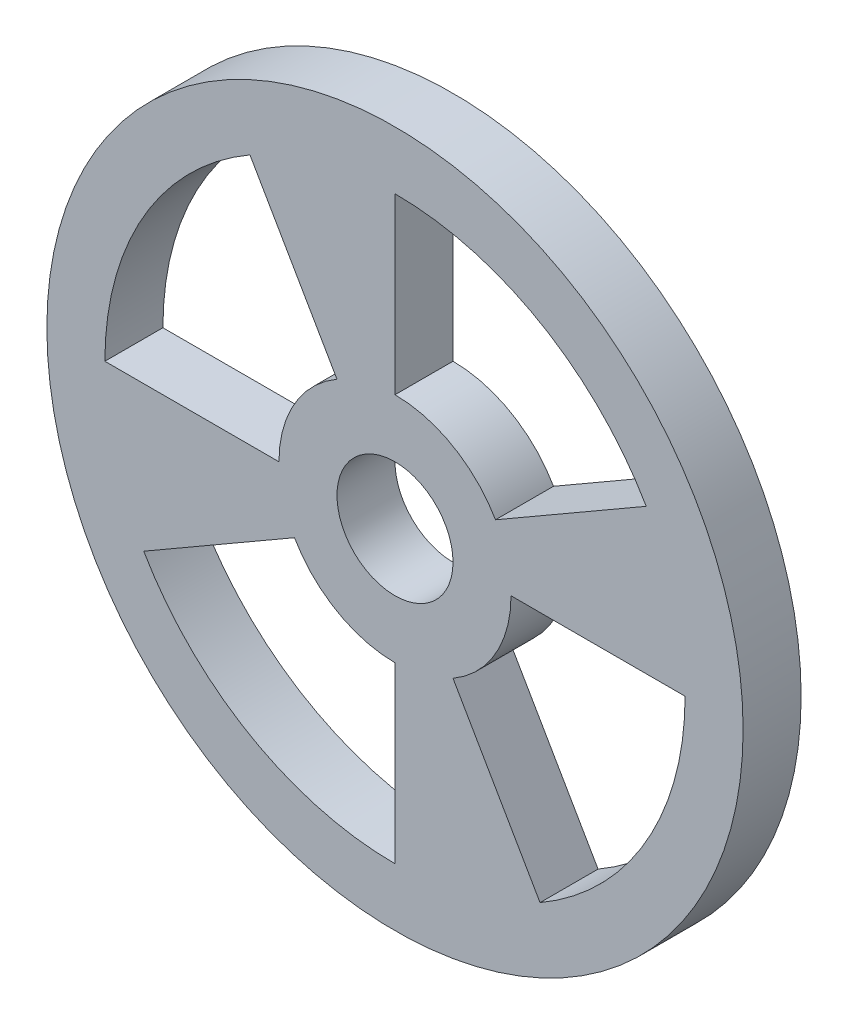
ISO-10303-21;
HEADER;
FILE_DESCRIPTION(('STEP AP214'),'2;1');
FILE_NAME('part.step','',(''),(''),'','','');
FILE_SCHEMA(('AUTOMOTIVE_DESIGN { 1 0 10303 214 1 1 1 1 }'));
ENDSEC;
DATA;
#1=APPLICATION_CONTEXT('core data for automotive mechanical design processes');
#2=APPLICATION_PROTOCOL_DEFINITION('international standard','automotive_design',2000,#1);
#3=PRODUCT_CONTEXT('',#1,'mechanical');
#4=PRODUCT('Part','Part','',(#3));
#5=PRODUCT_RELATED_PRODUCT_CATEGORY('part','',(#4));
#6=PRODUCT_DEFINITION_FORMATION('','',#4);
#7=PRODUCT_DEFINITION_CONTEXT('part definition',#1,'design');
#8=PRODUCT_DEFINITION('design','',#6,#7);
#9=PRODUCT_DEFINITION_SHAPE('','',#8);
#10=(LENGTH_UNIT() NAMED_UNIT(*) SI_UNIT(.MILLI.,.METRE.));
#11=(NAMED_UNIT(*) PLANE_ANGLE_UNIT() SI_UNIT($,.RADIAN.));
#12=(NAMED_UNIT(*) SI_UNIT($,.STERADIAN.) SOLID_ANGLE_UNIT());
#13=UNCERTAINTY_MEASURE_WITH_UNIT(LENGTH_MEASURE(1.E-05),#10,'distance_accuracy_value','');
#14=(GEOMETRIC_REPRESENTATION_CONTEXT(3) GLOBAL_UNCERTAINTY_ASSIGNED_CONTEXT((#13)) GLOBAL_UNIT_ASSIGNED_CONTEXT((#10,
#11,#12)) REPRESENTATION_CONTEXT('',''));
#15=CARTESIAN_POINT('',(0.,0.,0.));
#16=DIRECTION('',(0.,0.,1.));
#17=DIRECTION('',(1.,0.,0.));
#18=AXIS2_PLACEMENT_3D('',#15,#16,#17);
#19=CARTESIAN_POINT('',(0.,0.,10.));
#20=DIRECTION('',(0.,0.,1.));
#21=DIRECTION('',(1.,0.,0.));
#22=AXIS2_PLACEMENT_3D('',#19,#20,#21);
#23=PLANE('',#22);
#24=CARTESIAN_POINT('',(0.,0.,10.));
#25=DIRECTION('',(0.,0.,1.));
#26=DIRECTION('',(1.,0.,0.));
#27=AXIS2_PLACEMENT_3D('',#24,#25,#26);
#28=CIRCLE('',#27,50.0000000000001);
#29=CARTESIAN_POINT('',(25.,-43.3012701892219,10.));
#30=VERTEX_POINT('',#29);
#31=CARTESIAN_POINT('',(50.,0.,10.));
#32=VERTEX_POINT('',#31);
#33=EDGE_CURVE('E309',#30,#32,#28,.T.);
#34=ORIENTED_EDGE('',*,*,#33,.F.);
#35=DIRECTION('',(0.5,-0.866025403784439,0.));
#36=VECTOR('',#35,1.);
#37=CARTESIAN_POINT('',(0.,0.,10.));
#38=LINE('',#37,#36);
#39=CARTESIAN_POINT('',(10.,-17.3205080756888,10.));
#40=VERTEX_POINT('',#39);
#41=EDGE_CURVE('E306',#40,#30,#38,.T.);
#42=ORIENTED_EDGE('',*,*,#41,.F.);
#43=CARTESIAN_POINT('',(0.,0.,10.));
#44=DIRECTION('',(0.,0.,1.));
#45=DIRECTION('',(1.,0.,0.));
#46=AXIS2_PLACEMENT_3D('',#43,#44,#45);
#47=CIRCLE('',#46,20.0000000000001);
#48=CARTESIAN_POINT('',(20.,0.,10.));
#49=VERTEX_POINT('',#48);
#50=EDGE_CURVE('E244',#49,#40,#47,.F.);
#51=ORIENTED_EDGE('',*,*,#50,.F.);
#52=DIRECTION('',(-1.,0.,0.));
#53=VECTOR('',#52,1.);
#54=CARTESIAN_POINT('',(0.,0.,10.));
#55=LINE('',#54,#53);
#56=EDGE_CURVE('E301',#32,#49,#55,.T.);
#57=ORIENTED_EDGE('',*,*,#56,.F.);
#58=EDGE_LOOP('',(#34,#42,#51,#57));
#59=FACE_BOUND('',#58,.T.);
#60=CARTESIAN_POINT('',(0.,0.,10.));
#61=DIRECTION('',(0.,0.,1.));
#62=DIRECTION('',(1.,0.,0.));
#63=AXIS2_PLACEMENT_3D('',#60,#61,#62);
#64=CIRCLE('',#63,50.0000000000001);
#65=CARTESIAN_POINT('',(-43.3012701892219,-25.,10.));
#66=VERTEX_POINT('',#65);
#67=CARTESIAN_POINT('',(0.,-50.,10.));
#68=VERTEX_POINT('',#67);
#69=EDGE_CURVE('E298',#66,#68,#64,.T.);
#70=ORIENTED_EDGE('',*,*,#69,.F.);
#71=DIRECTION('',(-0.866025403784439,-0.5,0.));
#72=VECTOR('',#71,1.);
#73=CARTESIAN_POINT('',(0.,0.,10.));
#74=LINE('',#73,#72);
#75=CARTESIAN_POINT('',(-17.3205080756888,-10.,10.));
#76=VERTEX_POINT('',#75);
#77=EDGE_CURVE('E295',#76,#66,#74,.T.);
#78=ORIENTED_EDGE('',*,*,#77,.F.);
#79=CARTESIAN_POINT('',(0.,0.,10.));
#80=DIRECTION('',(0.,0.,1.));
#81=DIRECTION('',(1.,0.,0.));
#82=AXIS2_PLACEMENT_3D('',#79,#80,#81);
#83=CIRCLE('',#82,20.0000000000001);
#84=CARTESIAN_POINT('',(0.,-20.,10.));
#85=VERTEX_POINT('',#84);
#86=EDGE_CURVE('E292',#85,#76,#83,.F.);
#87=ORIENTED_EDGE('',*,*,#86,.F.);
#88=DIRECTION('',(0.,1.,0.));
#89=VECTOR('',#88,1.);
#90=CARTESIAN_POINT('',(0.,0.,10.));
#91=LINE('',#90,#89);
#92=EDGE_CURVE('E289',#68,#85,#91,.T.);
#93=ORIENTED_EDGE('',*,*,#92,.F.);
#94=EDGE_LOOP('',(#70,#78,#87,#93));
#95=FACE_BOUND('',#94,.T.);
#96=CARTESIAN_POINT('',(0.,0.,10.));
#97=DIRECTION('',(0.,0.,1.));
#98=DIRECTION('',(1.,0.,0.));
#99=AXIS2_PLACEMENT_3D('',#96,#97,#98);
#100=CIRCLE('',#99,50.0000000000001);
#101=CARTESIAN_POINT('',(-25.,43.3012701892219,10.));
#102=VERTEX_POINT('',#101);
#103=CARTESIAN_POINT('',(-50.,0.,10.));
#104=VERTEX_POINT('',#103);
#105=EDGE_CURVE('E186',#102,#104,#100,.T.);
#106=ORIENTED_EDGE('',*,*,#105,.F.);
#107=DIRECTION('',(-0.5,0.866025403784439,0.));
#108=VECTOR('',#107,1.);
#109=CARTESIAN_POINT('',(0.,0.,10.));
#110=LINE('',#109,#108);
#111=CARTESIAN_POINT('',(-10.,17.3205080756888,10.));
#112=VERTEX_POINT('',#111);
#113=EDGE_CURVE('E285',#112,#102,#110,.T.);
#114=ORIENTED_EDGE('',*,*,#113,.F.);
#115=CARTESIAN_POINT('',(0.,0.,10.));
#116=DIRECTION('',(0.,0.,1.));
#117=DIRECTION('',(1.,0.,0.));
#118=AXIS2_PLACEMENT_3D('',#115,#116,#117);
#119=CIRCLE('',#118,20.0000000000001);
#120=CARTESIAN_POINT('',(-20.,0.,10.));
#121=VERTEX_POINT('',#120);
#122=EDGE_CURVE('E282',#121,#112,#119,.F.);
#123=ORIENTED_EDGE('',*,*,#122,.F.);
#124=DIRECTION('',(1.,0.,0.));
#125=VECTOR('',#124,1.);
#126=CARTESIAN_POINT('',(0.,0.,10.));
#127=LINE('',#126,#125);
#128=EDGE_CURVE('E251',#104,#121,#127,.T.);
#129=ORIENTED_EDGE('',*,*,#128,.F.);
#130=EDGE_LOOP('',(#106,#114,#123,#129));
#131=FACE_BOUND('',#130,.T.);
#132=CARTESIAN_POINT('',(0.,0.,10.));
#133=DIRECTION('',(0.,0.,1.));
#134=DIRECTION('',(1.,0.,0.));
#135=AXIS2_PLACEMENT_3D('',#132,#133,#134);
#136=CIRCLE('',#135,50.0000000000001);
#137=CARTESIAN_POINT('',(43.3012701892219,25.,10.));
#138=VERTEX_POINT('',#137);
#139=CARTESIAN_POINT('',(0.,50.,10.));
#140=VERTEX_POINT('',#139);
#141=EDGE_CURVE('E336',#138,#140,#136,.T.);
#142=ORIENTED_EDGE('',*,*,#141,.F.);
#143=DIRECTION('',(0.866025403784439,0.5,0.));
#144=VECTOR('',#143,1.);
#145=CARTESIAN_POINT('',(0.,0.,10.));
#146=LINE('',#145,#144);
#147=CARTESIAN_POINT('',(17.3205080756888,10.,10.));
#148=VERTEX_POINT('',#147);
#149=EDGE_CURVE('E333',#148,#138,#146,.T.);
#150=ORIENTED_EDGE('',*,*,#149,.F.);
#151=CARTESIAN_POINT('',(0.,0.,10.));
#152=DIRECTION('',(0.,0.,1.));
#153=DIRECTION('',(1.,0.,0.));
#154=AXIS2_PLACEMENT_3D('',#151,#152,#153);
#155=CIRCLE('',#154,20.0000000000001);
#156=CARTESIAN_POINT('',(0.,20.,10.));
#157=VERTEX_POINT('',#156);
#158=EDGE_CURVE('E330',#157,#148,#155,.F.);
#159=ORIENTED_EDGE('',*,*,#158,.F.);
#160=DIRECTION('',(0.,-1.,0.));
#161=VECTOR('',#160,1.);
#162=CARTESIAN_POINT('',(0.,0.,10.));
#163=LINE('',#162,#161);
#164=EDGE_CURVE('E317',#140,#157,#163,.T.);
#165=ORIENTED_EDGE('',*,*,#164,.F.);
#166=EDGE_LOOP('',(#142,#150,#159,#165));
#167=FACE_BOUND('',#166,.T.);
#168=CARTESIAN_POINT('',(0.,0.,10.));
#169=DIRECTION('',(0.,0.,1.));
#170=DIRECTION('',(1.,0.,0.));
#171=AXIS2_PLACEMENT_3D('',#168,#169,#170);
#172=CIRCLE('',#171,60.);
#173=CARTESIAN_POINT('',(60.,0.,10.));
#174=VERTEX_POINT('',#173);
#175=EDGE_CURVE('E348',#174,#174,#172,.T.);
#176=ORIENTED_EDGE('',*,*,#175,.T.);
#177=EDGE_LOOP('',(#176));
#178=FACE_BOUND('',#177,.T.);
#179=CARTESIAN_POINT('',(0.,0.,10.));
#180=DIRECTION('',(0.,0.,1.));
#181=DIRECTION('',(1.,0.,0.));
#182=AXIS2_PLACEMENT_3D('',#179,#180,#181);
#183=CIRCLE('',#182,10.);
#184=CARTESIAN_POINT('',(10.,0.,10.));
#185=VERTEX_POINT('',#184);
#186=EDGE_CURVE('E340',#185,#185,#183,.T.);
#187=ORIENTED_EDGE('',*,*,#186,.F.);
#188=EDGE_LOOP('',(#187));
#189=FACE_BOUND('',#188,.T.);
#190=ADVANCED_FACE('F51',(#59,#95,#131,#167,#178,#189),#23,.T.);
#191=CARTESIAN_POINT('',(0.,0.,0.));
#192=DIRECTION('',(0.,0.,1.));
#193=DIRECTION('',(1.,0.,0.));
#194=AXIS2_PLACEMENT_3D('',#191,#192,#193);
#195=PLANE('',#194);
#196=DIRECTION('',(0.5,-0.866025403784439,0.));
#197=VECTOR('',#196,1.);
#198=CARTESIAN_POINT('',(0.,0.,0.));
#199=LINE('',#198,#197);
#200=CARTESIAN_POINT('',(10.,-17.3205080756888,0.));
#201=VERTEX_POINT('',#200);
#202=CARTESIAN_POINT('',(25.,-43.3012701892219,0.));
#203=VERTEX_POINT('',#202);
#204=EDGE_CURVE('E61',#201,#203,#199,.T.);
#205=ORIENTED_EDGE('',*,*,#204,.T.);
#206=CARTESIAN_POINT('',(0.,0.,0.));
#207=DIRECTION('',(0.,0.,1.));
#208=DIRECTION('',(1.,0.,0.));
#209=AXIS2_PLACEMENT_3D('',#206,#207,#208);
#210=CIRCLE('',#209,50.0000000000001);
#211=CARTESIAN_POINT('',(50.,0.,0.));
#212=VERTEX_POINT('',#211);
#213=EDGE_CURVE('E11',#203,#212,#210,.T.);
#214=ORIENTED_EDGE('',*,*,#213,.T.);
#215=DIRECTION('',(-1.,0.,0.));
#216=VECTOR('',#215,1.);
#217=CARTESIAN_POINT('',(0.,0.,0.));
#218=LINE('',#217,#216);
#219=CARTESIAN_POINT('',(20.,0.,0.));
#220=VERTEX_POINT('',#219);
#221=EDGE_CURVE('E217',#212,#220,#218,.T.);
#222=ORIENTED_EDGE('',*,*,#221,.T.);
#223=CARTESIAN_POINT('',(0.,0.,0.));
#224=DIRECTION('',(0.,0.,1.));
#225=DIRECTION('',(1.,0.,0.));
#226=AXIS2_PLACEMENT_3D('',#223,#224,#225);
#227=CIRCLE('',#226,20.0000000000001);
#228=EDGE_CURVE('E221',#220,#201,#227,.F.);
#229=ORIENTED_EDGE('',*,*,#228,.T.);
#230=EDGE_LOOP('',(#205,#214,#222,#229));
#231=FACE_BOUND('',#230,.T.);
#232=DIRECTION('',(-0.866025403784439,-0.5,0.));
#233=VECTOR('',#232,1.);
#234=CARTESIAN_POINT('',(0.,0.,0.));
#235=LINE('',#234,#233);
#236=CARTESIAN_POINT('',(-17.3205080756888,-10.,0.));
#237=VERTEX_POINT('',#236);
#238=CARTESIAN_POINT('',(-43.3012701892219,-25.,0.));
#239=VERTEX_POINT('',#238);
#240=EDGE_CURVE('E209',#237,#239,#235,.T.);
#241=ORIENTED_EDGE('',*,*,#240,.T.);
#242=CARTESIAN_POINT('',(0.,0.,0.));
#243=DIRECTION('',(0.,0.,1.));
#244=DIRECTION('',(1.,0.,0.));
#245=AXIS2_PLACEMENT_3D('',#242,#243,#244);
#246=CIRCLE('',#245,50.0000000000001);
#247=CARTESIAN_POINT('',(0.,-50.,0.));
#248=VERTEX_POINT('',#247);
#249=EDGE_CURVE('E213',#239,#248,#246,.T.);
#250=ORIENTED_EDGE('',*,*,#249,.T.);
#251=DIRECTION('',(0.,1.,0.));
#252=VECTOR('',#251,1.);
#253=CARTESIAN_POINT('',(0.,0.,0.));
#254=LINE('',#253,#252);
#255=CARTESIAN_POINT('',(0.,-20.,0.));
#256=VERTEX_POINT('',#255);
#257=EDGE_CURVE('E195',#248,#256,#254,.T.);
#258=ORIENTED_EDGE('',*,*,#257,.T.);
#259=CARTESIAN_POINT('',(0.,0.,0.));
#260=DIRECTION('',(0.,0.,1.));
#261=DIRECTION('',(1.,0.,0.));
#262=AXIS2_PLACEMENT_3D('',#259,#260,#261);
#263=CIRCLE('',#262,20.0000000000001);
#264=EDGE_CURVE('E201',#256,#237,#263,.F.);
#265=ORIENTED_EDGE('',*,*,#264,.T.);
#266=EDGE_LOOP('',(#241,#250,#258,#265));
#267=FACE_BOUND('',#266,.T.);
#268=DIRECTION('',(-0.5,0.866025403784439,0.));
#269=VECTOR('',#268,1.);
#270=CARTESIAN_POINT('',(0.,0.,0.));
#271=LINE('',#270,#269);
#272=CARTESIAN_POINT('',(-10.,17.3205080756888,0.));
#273=VERTEX_POINT('',#272);
#274=CARTESIAN_POINT('',(-25.,43.3012701892219,0.));
#275=VERTEX_POINT('',#274);
#276=EDGE_CURVE('E193',#273,#275,#271,.T.);
#277=ORIENTED_EDGE('',*,*,#276,.T.);
#278=CARTESIAN_POINT('',(0.,0.,0.));
#279=DIRECTION('',(0.,0.,1.));
#280=DIRECTION('',(1.,0.,0.));
#281=AXIS2_PLACEMENT_3D('',#278,#279,#280);
#282=CIRCLE('',#281,50.0000000000001);
#283=CARTESIAN_POINT('',(-50.,0.,0.));
#284=VERTEX_POINT('',#283);
#285=EDGE_CURVE('E183',#275,#284,#282,.T.);
#286=ORIENTED_EDGE('',*,*,#285,.T.);
#287=DIRECTION('',(1.,0.,0.));
#288=VECTOR('',#287,1.);
#289=CARTESIAN_POINT('',(0.,0.,0.));
#290=LINE('',#289,#288);
#291=CARTESIAN_POINT('',(-20.,0.,0.));
#292=VERTEX_POINT('',#291);
#293=EDGE_CURVE('E165',#284,#292,#290,.T.);
#294=ORIENTED_EDGE('',*,*,#293,.T.);
#295=CARTESIAN_POINT('',(0.,0.,0.));
#296=DIRECTION('',(0.,0.,1.));
#297=DIRECTION('',(1.,0.,0.));
#298=AXIS2_PLACEMENT_3D('',#295,#296,#297);
#299=CIRCLE('',#298,20.0000000000001);
#300=EDGE_CURVE('E177',#292,#273,#299,.F.);
#301=ORIENTED_EDGE('',*,*,#300,.T.);
#302=EDGE_LOOP('',(#277,#286,#294,#301));
#303=FACE_BOUND('',#302,.T.);
#304=DIRECTION('',(0.866025403784439,0.5,0.));
#305=VECTOR('',#304,1.);
#306=CARTESIAN_POINT('',(0.,0.,0.));
#307=LINE('',#306,#305);
#308=CARTESIAN_POINT('',(17.3205080756888,10.,0.));
#309=VERTEX_POINT('',#308);
#310=CARTESIAN_POINT('',(43.3012701892219,25.,0.));
#311=VERTEX_POINT('',#310);
#312=EDGE_CURVE('E362',#309,#311,#307,.T.);
#313=ORIENTED_EDGE('',*,*,#312,.T.);
#314=CARTESIAN_POINT('',(0.,0.,0.));
#315=DIRECTION('',(0.,0.,1.));
#316=DIRECTION('',(1.,0.,0.));
#317=AXIS2_PLACEMENT_3D('',#314,#315,#316);
#318=CIRCLE('',#317,50.0000000000001);
#319=CARTESIAN_POINT('',(0.,50.,0.));
#320=VERTEX_POINT('',#319);
#321=EDGE_CURVE('E178',#311,#320,#318,.T.);
#322=ORIENTED_EDGE('',*,*,#321,.T.);
#323=DIRECTION('',(0.,-1.,0.));
#324=VECTOR('',#323,1.);
#325=CARTESIAN_POINT('',(0.,0.,0.));
#326=LINE('',#325,#324);
#327=CARTESIAN_POINT('',(0.,20.,0.));
#328=VERTEX_POINT('',#327);
#329=EDGE_CURVE('E352',#320,#328,#326,.T.);
#330=ORIENTED_EDGE('',*,*,#329,.T.);
#331=CARTESIAN_POINT('',(0.,0.,0.));
#332=DIRECTION('',(0.,0.,1.));
#333=DIRECTION('',(1.,0.,0.));
#334=AXIS2_PLACEMENT_3D('',#331,#332,#333);
#335=CIRCLE('',#334,20.0000000000001);
#336=EDGE_CURVE('E358',#328,#309,#335,.F.);
#337=ORIENTED_EDGE('',*,*,#336,.T.);
#338=EDGE_LOOP('',(#313,#322,#330,#337));
#339=FACE_BOUND('',#338,.T.);
#340=CARTESIAN_POINT('',(0.,0.,0.));
#341=DIRECTION('',(0.,0.,1.));
#342=DIRECTION('',(1.,0.,0.));
#343=AXIS2_PLACEMENT_3D('',#340,#341,#342);
#344=CIRCLE('',#343,60.);
#345=CARTESIAN_POINT('',(60.,0.,0.));
#346=VERTEX_POINT('',#345);
#347=EDGE_CURVE('E344',#346,#346,#344,.T.);
#348=ORIENTED_EDGE('',*,*,#347,.F.);
#349=EDGE_LOOP('',(#348));
#350=FACE_BOUND('',#349,.T.);
#351=CARTESIAN_POINT('',(0.,0.,0.));
#352=DIRECTION('',(0.,0.,1.));
#353=DIRECTION('',(1.,0.,0.));
#354=AXIS2_PLACEMENT_3D('',#351,#352,#353);
#355=CIRCLE('',#354,10.);
#356=CARTESIAN_POINT('',(10.,0.,0.));
#357=VERTEX_POINT('',#356);
#358=EDGE_CURVE('E339',#357,#357,#355,.T.);
#359=ORIENTED_EDGE('',*,*,#358,.T.);
#360=EDGE_LOOP('',(#359));
#361=FACE_BOUND('',#360,.T.);
#362=ADVANCED_FACE('F191',(#231,#267,#303,#339,#350,#361),#195,.F.);
#363=CARTESIAN_POINT('',(0.,0.,10.));
#364=DIRECTION('',(0.,0.,-1.));
#365=DIRECTION('',(-1.,0.,0.));
#366=AXIS2_PLACEMENT_3D('',#363,#364,#365);
#367=CYLINDRICAL_SURFACE('',#366,60.);
#368=ORIENTED_EDGE('',*,*,#175,.F.);
#369=EDGE_LOOP('',(#368));
#370=FACE_BOUND('',#369,.T.);
#371=ORIENTED_EDGE('',*,*,#347,.T.);
#372=EDGE_LOOP('',(#371));
#373=FACE_BOUND('',#372,.T.);
#374=ADVANCED_FACE('F54',(#370,#373),#367,.T.);
#375=CARTESIAN_POINT('',(0.,0.,10.));
#376=DIRECTION('',(0.,0.,-1.));
#377=DIRECTION('',(-1.,0.,0.));
#378=AXIS2_PLACEMENT_3D('',#375,#376,#377);
#379=CYLINDRICAL_SURFACE('',#378,10.);
#380=ORIENTED_EDGE('',*,*,#186,.T.);
#381=EDGE_LOOP('',(#380));
#382=FACE_BOUND('',#381,.T.);
#383=ORIENTED_EDGE('',*,*,#358,.F.);
#384=EDGE_LOOP('',(#383));
#385=FACE_BOUND('',#384,.T.);
#386=ADVANCED_FACE('F388',(#382,#385),#379,.F.);
#387=CARTESIAN_POINT('',(0.,0.,-121.));
#388=DIRECTION('',(0.,0.,1.));
#389=DIRECTION('',(1.,0.,0.));
#390=AXIS2_PLACEMENT_3D('',#387,#388,#389);
#391=CYLINDRICAL_SURFACE('',#390,50.0000000000001);
#392=ORIENTED_EDGE('',*,*,#141,.T.);
#393=DIRECTION('',(0.,0.,1.));
#394=VECTOR('',#393,1.);
#395=CARTESIAN_POINT('',(0.,50.,-121.));
#396=LINE('',#395,#394);
#397=EDGE_CURVE('E312',#320,#140,#396,.T.);
#398=ORIENTED_EDGE('',*,*,#397,.F.);
#399=ORIENTED_EDGE('',*,*,#321,.F.);
#400=DIRECTION('',(0.,0.,1.));
#401=VECTOR('',#400,1.);
#402=CARTESIAN_POINT('',(43.3012701892219,25.,-121.));
#403=LINE('',#402,#401);
#404=EDGE_CURVE('E313',#311,#138,#403,.T.);
#405=ORIENTED_EDGE('',*,*,#404,.T.);
#406=EDGE_LOOP('',(#392,#398,#399,#405));
#407=FACE_BOUND('',#406,.T.);
#408=ADVANCED_FACE('F391',(#407),#391,.F.);
#409=CARTESIAN_POINT('',(17.3205080756888,10.,-121.));
#410=DIRECTION('',(0.5,-0.866025403784439,0.));
#411=DIRECTION('',(0.866025403784439,0.5,0.));
#412=AXIS2_PLACEMENT_3D('',#409,#410,#411);
#413=PLANE('',#412);
#414=ORIENTED_EDGE('',*,*,#149,.T.);
#415=ORIENTED_EDGE('',*,*,#404,.F.);
#416=ORIENTED_EDGE('',*,*,#312,.F.);
#417=DIRECTION('',(0.,0.,1.));
#418=VECTOR('',#417,1.);
#419=CARTESIAN_POINT('',(17.3205080756888,10.,-121.));
#420=LINE('',#419,#418);
#421=EDGE_CURVE('E318',#309,#148,#420,.T.);
#422=ORIENTED_EDGE('',*,*,#421,.T.);
#423=EDGE_LOOP('',(#414,#415,#416,#422));
#424=FACE_BOUND('',#423,.T.);
#425=ADVANCED_FACE('F407',(#424),#413,.F.);
#426=CARTESIAN_POINT('',(0.,0.,-121.));
#427=DIRECTION('',(0.,0.,1.));
#428=DIRECTION('',(1.,0.,0.));
#429=AXIS2_PLACEMENT_3D('',#426,#427,#428);
#430=CYLINDRICAL_SURFACE('',#429,20.0000000000001);
#431=ORIENTED_EDGE('',*,*,#158,.T.);
#432=ORIENTED_EDGE('',*,*,#421,.F.);
#433=ORIENTED_EDGE('',*,*,#336,.F.);
#434=DIRECTION('',(0.,0.,1.));
#435=VECTOR('',#434,1.);
#436=CARTESIAN_POINT('',(0.,20.,-121.));
#437=LINE('',#436,#435);
#438=EDGE_CURVE('E322',#328,#157,#437,.T.);
#439=ORIENTED_EDGE('',*,*,#438,.T.);
#440=EDGE_LOOP('',(#431,#432,#433,#439));
#441=FACE_BOUND('',#440,.T.);
#442=ADVANCED_FACE('F415',(#441),#430,.T.);
#443=CARTESIAN_POINT('',(0.,50.,-121.));
#444=DIRECTION('',(-1.,0.,0.));
#445=DIRECTION('',(0.,-1.,0.));
#446=AXIS2_PLACEMENT_3D('',#443,#444,#445);
#447=PLANE('',#446);
#448=ORIENTED_EDGE('',*,*,#164,.T.);
#449=ORIENTED_EDGE('',*,*,#438,.F.);
#450=ORIENTED_EDGE('',*,*,#329,.F.);
#451=ORIENTED_EDGE('',*,*,#397,.T.);
#452=EDGE_LOOP('',(#448,#449,#450,#451));
#453=FACE_BOUND('',#452,.T.);
#454=ADVANCED_FACE('F410',(#453),#447,.F.);
#455=CARTESIAN_POINT('',(0.,0.,-121.));
#456=DIRECTION('',(0.,0.,1.));
#457=DIRECTION('',(1.,0.,0.));
#458=AXIS2_PLACEMENT_3D('',#455,#456,#457);
#459=CYLINDRICAL_SURFACE('',#458,50.0000000000001);
#460=ORIENTED_EDGE('',*,*,#105,.T.);
#461=DIRECTION('',(0.,0.,1.));
#462=VECTOR('',#461,1.);
#463=CARTESIAN_POINT('',(-50.,0.,-121.));
#464=LINE('',#463,#462);
#465=EDGE_CURVE('E168',#284,#104,#464,.T.);
#466=ORIENTED_EDGE('',*,*,#465,.F.);
#467=ORIENTED_EDGE('',*,*,#285,.F.);
#468=DIRECTION('',(0.,0.,1.));
#469=VECTOR('',#468,1.);
#470=CARTESIAN_POINT('',(-25.,43.3012701892219,-121.));
#471=LINE('',#470,#469);
#472=EDGE_CURVE('E271',#275,#102,#471,.T.);
#473=ORIENTED_EDGE('',*,*,#472,.T.);
#474=EDGE_LOOP('',(#460,#466,#467,#473));
#475=FACE_BOUND('',#474,.T.);
#476=ADVANCED_FACE('F181',(#475),#459,.F.);
#477=CARTESIAN_POINT('',(-10.,17.3205080756888,-121.));
#478=DIRECTION('',(0.866025403784439,0.5,0.));
#479=DIRECTION('',(-0.5,0.866025403784439,0.));
#480=AXIS2_PLACEMENT_3D('',#477,#478,#479);
#481=PLANE('',#480);
#482=ORIENTED_EDGE('',*,*,#113,.T.);
#483=ORIENTED_EDGE('',*,*,#472,.F.);
#484=ORIENTED_EDGE('',*,*,#276,.F.);
#485=DIRECTION('',(0.,0.,1.));
#486=VECTOR('',#485,1.);
#487=CARTESIAN_POINT('',(-10.,17.3205080756888,-121.));
#488=LINE('',#487,#486);
#489=EDGE_CURVE('E274',#273,#112,#488,.T.);
#490=ORIENTED_EDGE('',*,*,#489,.T.);
#491=EDGE_LOOP('',(#482,#483,#484,#490));
#492=FACE_BOUND('',#491,.T.);
#493=ADVANCED_FACE('F374',(#492),#481,.F.);
#494=CARTESIAN_POINT('',(0.,0.,-121.));
#495=DIRECTION('',(0.,0.,1.));
#496=DIRECTION('',(1.,0.,0.));
#497=AXIS2_PLACEMENT_3D('',#494,#495,#496);
#498=CYLINDRICAL_SURFACE('',#497,20.0000000000001);
#499=ORIENTED_EDGE('',*,*,#122,.T.);
#500=ORIENTED_EDGE('',*,*,#489,.F.);
#501=ORIENTED_EDGE('',*,*,#300,.F.);
#502=DIRECTION('',(0.,0.,1.));
#503=VECTOR('',#502,1.);
#504=CARTESIAN_POINT('',(-20.,0.,-121.));
#505=LINE('',#504,#503);
#506=EDGE_CURVE('E171',#292,#121,#505,.T.);
#507=ORIENTED_EDGE('',*,*,#506,.T.);
#508=EDGE_LOOP('',(#499,#500,#501,#507));
#509=FACE_BOUND('',#508,.T.);
#510=ADVANCED_FACE('F370',(#509),#498,.T.);
#511=CARTESIAN_POINT('',(-50.,0.,-121.));
#512=DIRECTION('',(0.,-1.,0.));
#513=DIRECTION('',(1.,0.,0.));
#514=AXIS2_PLACEMENT_3D('',#511,#512,#513);
#515=PLANE('',#514);
#516=ORIENTED_EDGE('',*,*,#128,.T.);
#517=ORIENTED_EDGE('',*,*,#506,.F.);
#518=ORIENTED_EDGE('',*,*,#293,.F.);
#519=ORIENTED_EDGE('',*,*,#465,.T.);
#520=EDGE_LOOP('',(#516,#517,#518,#519));
#521=FACE_BOUND('',#520,.T.);
#522=ADVANCED_FACE('F167',(#521),#515,.F.);
#523=CARTESIAN_POINT('',(0.,0.,-121.));
#524=DIRECTION('',(0.,0.,1.));
#525=DIRECTION('',(1.,0.,0.));
#526=AXIS2_PLACEMENT_3D('',#523,#524,#525);
#527=CYLINDRICAL_SURFACE('',#526,50.0000000000001);
#528=ORIENTED_EDGE('',*,*,#69,.T.);
#529=DIRECTION('',(0.,0.,1.));
#530=VECTOR('',#529,1.);
#531=CARTESIAN_POINT('',(0.,-50.,-121.));
#532=LINE('',#531,#530);
#533=EDGE_CURVE('E76',#248,#68,#532,.T.);
#534=ORIENTED_EDGE('',*,*,#533,.F.);
#535=ORIENTED_EDGE('',*,*,#249,.F.);
#536=DIRECTION('',(0.,0.,1.));
#537=VECTOR('',#536,1.);
#538=CARTESIAN_POINT('',(-43.3012701892219,-25.,-121.));
#539=LINE('',#538,#537);
#540=EDGE_CURVE('E257',#239,#66,#539,.T.);
#541=ORIENTED_EDGE('',*,*,#540,.T.);
#542=EDGE_LOOP('',(#528,#534,#535,#541));
#543=FACE_BOUND('',#542,.T.);
#544=ADVANCED_FACE('F431',(#543),#527,.F.);
#545=CARTESIAN_POINT('',(-17.3205080756888,-10.,-121.));
#546=DIRECTION('',(-0.5,0.866025403784439,0.));
#547=DIRECTION('',(-0.866025403784439,-0.5,0.));
#548=AXIS2_PLACEMENT_3D('',#545,#546,#547);
#549=PLANE('',#548);
#550=ORIENTED_EDGE('',*,*,#77,.T.);
#551=ORIENTED_EDGE('',*,*,#540,.F.);
#552=ORIENTED_EDGE('',*,*,#240,.F.);
#553=DIRECTION('',(0.,0.,1.));
#554=VECTOR('',#553,1.);
#555=CARTESIAN_POINT('',(-17.3205080756888,-10.,-121.));
#556=LINE('',#555,#554);
#557=EDGE_CURVE('E261',#237,#76,#556,.T.);
#558=ORIENTED_EDGE('',*,*,#557,.T.);
#559=EDGE_LOOP('',(#550,#551,#552,#558));
#560=FACE_BOUND('',#559,.T.);
#561=ADVANCED_FACE('F439',(#560),#549,.F.);
#562=CARTESIAN_POINT('',(0.,0.,-121.));
#563=DIRECTION('',(0.,0.,1.));
#564=DIRECTION('',(1.,0.,0.));
#565=AXIS2_PLACEMENT_3D('',#562,#563,#564);
#566=CYLINDRICAL_SURFACE('',#565,20.0000000000001);
#567=ORIENTED_EDGE('',*,*,#86,.T.);
#568=ORIENTED_EDGE('',*,*,#557,.F.);
#569=ORIENTED_EDGE('',*,*,#264,.F.);
#570=DIRECTION('',(0.,0.,1.));
#571=VECTOR('',#570,1.);
#572=CARTESIAN_POINT('',(0.,-20.,-121.));
#573=LINE('',#572,#571);
#574=EDGE_CURVE('E265',#256,#85,#573,.T.);
#575=ORIENTED_EDGE('',*,*,#574,.T.);
#576=EDGE_LOOP('',(#567,#568,#569,#575));
#577=FACE_BOUND('',#576,.T.);
#578=ADVANCED_FACE('F448',(#577),#566,.T.);
#579=CARTESIAN_POINT('',(0.,-50.,-121.));
#580=DIRECTION('',(1.,0.,0.));
#581=DIRECTION('',(0.,1.,0.));
#582=AXIS2_PLACEMENT_3D('',#579,#580,#581);
#583=PLANE('',#582);
#584=ORIENTED_EDGE('',*,*,#92,.T.);
#585=ORIENTED_EDGE('',*,*,#574,.F.);
#586=ORIENTED_EDGE('',*,*,#257,.F.);
#587=ORIENTED_EDGE('',*,*,#533,.T.);
#588=EDGE_LOOP('',(#584,#585,#586,#587));
#589=FACE_BOUND('',#588,.T.);
#590=ADVANCED_FACE('F442',(#589),#583,.F.);
#591=CARTESIAN_POINT('',(0.,0.,-121.));
#592=DIRECTION('',(0.,0.,1.));
#593=DIRECTION('',(1.,0.,0.));
#594=AXIS2_PLACEMENT_3D('',#591,#592,#593);
#595=CYLINDRICAL_SURFACE('',#594,50.0000000000001);
#596=ORIENTED_EDGE('',*,*,#33,.T.);
#597=DIRECTION('',(0.,0.,1.));
#598=VECTOR('',#597,1.);
#599=CARTESIAN_POINT('',(50.,0.,-121.));
#600=LINE('',#599,#598);
#601=EDGE_CURVE('E68',#212,#32,#600,.T.);
#602=ORIENTED_EDGE('',*,*,#601,.F.);
#603=ORIENTED_EDGE('',*,*,#213,.F.);
#604=DIRECTION('',(0.,0.,1.));
#605=VECTOR('',#604,1.);
#606=CARTESIAN_POINT('',(25.,-43.3012701892219,-121.));
#607=LINE('',#606,#605);
#608=EDGE_CURVE('E239',#203,#30,#607,.T.);
#609=ORIENTED_EDGE('',*,*,#608,.T.);
#610=EDGE_LOOP('',(#596,#602,#603,#609));
#611=FACE_BOUND('',#610,.T.);
#612=ADVANCED_FACE('F447',(#611),#595,.F.);
#613=CARTESIAN_POINT('',(10.,-17.3205080756888,-121.));
#614=DIRECTION('',(-0.866025403784439,-0.5,0.));
#615=DIRECTION('',(0.5,-0.866025403784439,0.));
#616=AXIS2_PLACEMENT_3D('',#613,#614,#615);
#617=PLANE('',#616);
#618=ORIENTED_EDGE('',*,*,#41,.T.);
#619=ORIENTED_EDGE('',*,*,#608,.F.);
#620=ORIENTED_EDGE('',*,*,#204,.F.);
#621=DIRECTION('',(0.,0.,1.));
#622=VECTOR('',#621,1.);
#623=CARTESIAN_POINT('',(10.,-17.3205080756888,-121.));
#624=LINE('',#623,#622);
#625=EDGE_CURVE('E236',#201,#40,#624,.T.);
#626=ORIENTED_EDGE('',*,*,#625,.T.);
#627=EDGE_LOOP('',(#618,#619,#620,#626));
#628=FACE_BOUND('',#627,.T.);
#629=ADVANCED_FACE('F235',(#628),#617,.F.);
#630=CARTESIAN_POINT('',(0.,0.,-121.));
#631=DIRECTION('',(0.,0.,1.));
#632=DIRECTION('',(1.,0.,0.));
#633=AXIS2_PLACEMENT_3D('',#630,#631,#632);
#634=CYLINDRICAL_SURFACE('',#633,20.0000000000001);
#635=ORIENTED_EDGE('',*,*,#50,.T.);
#636=ORIENTED_EDGE('',*,*,#625,.F.);
#637=ORIENTED_EDGE('',*,*,#228,.F.);
#638=DIRECTION('',(0.,0.,1.));
#639=VECTOR('',#638,1.);
#640=CARTESIAN_POINT('',(20.,0.,-121.));
#641=LINE('',#640,#639);
#642=EDGE_CURVE('E246',#220,#49,#641,.T.);
#643=ORIENTED_EDGE('',*,*,#642,.T.);
#644=EDGE_LOOP('',(#635,#636,#637,#643));
#645=FACE_BOUND('',#644,.T.);
#646=ADVANCED_FACE('F241',(#645),#634,.T.);
#647=CARTESIAN_POINT('',(50.,0.,-121.));
#648=DIRECTION('',(0.,1.,0.));
#649=DIRECTION('',(-1.,0.,0.));
#650=AXIS2_PLACEMENT_3D('',#647,#648,#649);
#651=PLANE('',#650);
#652=ORIENTED_EDGE('',*,*,#56,.T.);
#653=ORIENTED_EDGE('',*,*,#642,.F.);
#654=ORIENTED_EDGE('',*,*,#221,.F.);
#655=ORIENTED_EDGE('',*,*,#601,.T.);
#656=EDGE_LOOP('',(#652,#653,#654,#655));
#657=FACE_BOUND('',#656,.T.);
#658=ADVANCED_FACE('F460',(#657),#651,.F.);
#659=CLOSED_SHELL('',(#190,#362,#374,#386,#408,#425,#442,#454,#476,#493,#510,#522,#544,#561,
#578,#590,#612,#629,#646,#658));
#660=MANIFOLD_SOLID_BREP('B2',#659);
#661=ADVANCED_BREP_SHAPE_REPRESENTATION('',(#18,#660),#14);
#662=SHAPE_DEFINITION_REPRESENTATION(#9,#661);
ENDSEC;
END-ISO-10303-21;
